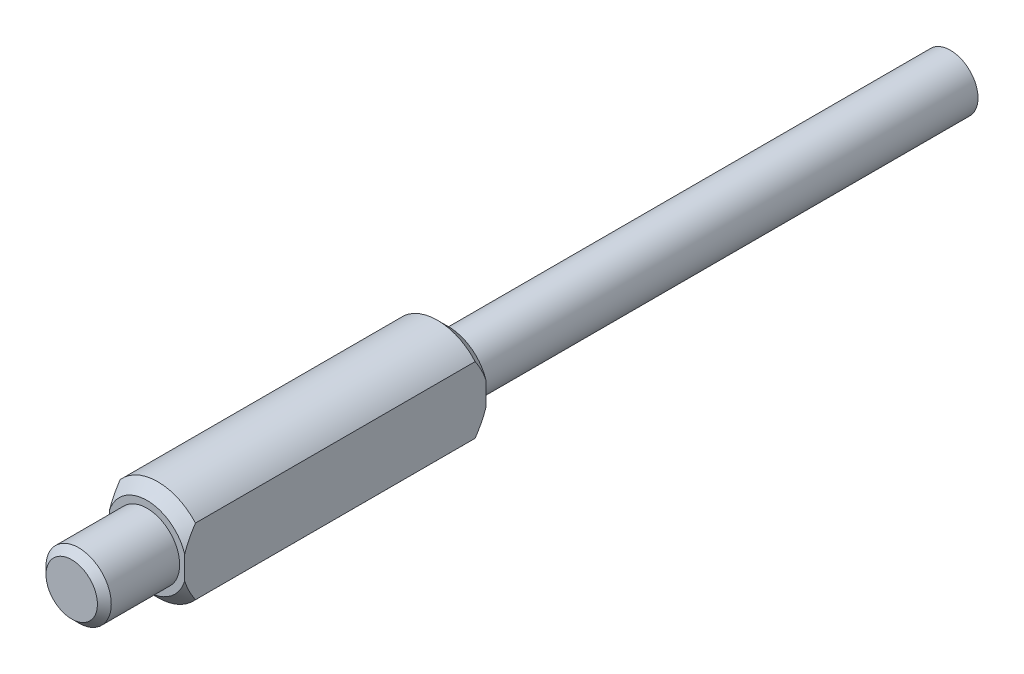
ISO-10303-21;
HEADER;
FILE_DESCRIPTION(('STEP AP214'),'2;1');
FILE_NAME('part.step','',(''),(''),'','','');
FILE_SCHEMA(('AUTOMOTIVE_DESIGN { 1 0 10303 214 1 1 1 1 }'));
ENDSEC;
DATA;
#1=APPLICATION_CONTEXT('core data for automotive mechanical design processes');
#2=APPLICATION_PROTOCOL_DEFINITION('international standard','automotive_design',2000,#1);
#3=PRODUCT_CONTEXT('',#1,'mechanical');
#4=PRODUCT('Part','Part','',(#3));
#5=PRODUCT_RELATED_PRODUCT_CATEGORY('part','',(#4));
#6=PRODUCT_DEFINITION_FORMATION('','',#4);
#7=PRODUCT_DEFINITION_CONTEXT('part definition',#1,'design');
#8=PRODUCT_DEFINITION('design','',#6,#7);
#9=PRODUCT_DEFINITION_SHAPE('','',#8);
#10=(LENGTH_UNIT() NAMED_UNIT(*) SI_UNIT(.MILLI.,.METRE.));
#11=(NAMED_UNIT(*) PLANE_ANGLE_UNIT() SI_UNIT($,.RADIAN.));
#12=(NAMED_UNIT(*) SI_UNIT($,.STERADIAN.) SOLID_ANGLE_UNIT());
#13=UNCERTAINTY_MEASURE_WITH_UNIT(LENGTH_MEASURE(1.E-05),#10,'distance_accuracy_value','');
#14=(GEOMETRIC_REPRESENTATION_CONTEXT(3) GLOBAL_UNCERTAINTY_ASSIGNED_CONTEXT((#13)) GLOBAL_UNIT_ASSIGNED_CONTEXT((#10,
#11,#12)) REPRESENTATION_CONTEXT('',''));
#15=CARTESIAN_POINT('',(0.,0.,0.));
#16=DIRECTION('',(0.,0.,1.));
#17=DIRECTION('',(1.,0.,0.));
#18=AXIS2_PLACEMENT_3D('',#15,#16,#17);
#19=CARTESIAN_POINT('',(0.,0.,0.));
#20=DIRECTION('',(0.,0.,-1.));
#21=DIRECTION('',(-1.,0.,0.));
#22=AXIS2_PLACEMENT_3D('',#19,#20,#21);
#23=PLANE('',#22);
#24=CARTESIAN_POINT('',(0.,0.,0.));
#25=DIRECTION('',(0.,0.,-1.));
#26=DIRECTION('',(-1.,0.,0.));
#27=AXIS2_PLACEMENT_3D('',#24,#25,#26);
#28=CIRCLE('',#27,1.02400000002945);
#29=CARTESIAN_POINT('',(-1.02400000002945,0.,0.));
#30=VERTEX_POINT('',#29);
#31=EDGE_CURVE('E18',#30,#30,#28,.T.);
#32=ORIENTED_EDGE('',*,*,#31,.F.);
#33=EDGE_LOOP('',(#32));
#34=FACE_BOUND('',#33,.T.);
#35=ADVANCED_FACE('F15',(#34),#23,.F.);
#36=CARTESIAN_POINT('',(0.,0.,-0.275999999928445));
#37=DIRECTION('',(0.,0.,-1.));
#38=DIRECTION('',(-1.,0.,0.));
#39=AXIS2_PLACEMENT_3D('',#36,#37,#38);
#40=CONICAL_SURFACE('',#39,1.30000000001473,0.785398163500426);
#41=ORIENTED_EDGE('',*,*,#31,.T.);
#42=EDGE_LOOP('',(#41));
#43=FACE_BOUND('',#42,.T.);
#44=CARTESIAN_POINT('',(0.,0.,-0.275999999999998));
#45=DIRECTION('',(0.,0.,1.));
#46=DIRECTION('',(1.,0.,0.));
#47=AXIS2_PLACEMENT_3D('',#44,#45,#46);
#48=CIRCLE('',#47,1.3);
#49=CARTESIAN_POINT('',(1.3,0.,-0.275999999999998));
#50=VERTEX_POINT('',#49);
#51=EDGE_CURVE('E87',#50,#50,#48,.F.);
#52=ORIENTED_EDGE('',*,*,#51,.F.);
#53=EDGE_LOOP('',(#52));
#54=FACE_BOUND('',#53,.T.);
#55=ADVANCED_FACE('F155',(#43,#54),#40,.T.);
#56=CARTESIAN_POINT('',(0.,0.,-35.));
#57=DIRECTION('',(0.,0.,1.));
#58=DIRECTION('',(1.,0.,0.));
#59=AXIS2_PLACEMENT_3D('',#56,#57,#58);
#60=CYLINDRICAL_SURFACE('',#59,1.3);
#61=ORIENTED_EDGE('',*,*,#51,.T.);
#62=EDGE_LOOP('',(#61));
#63=FACE_BOUND('',#62,.T.);
#64=CARTESIAN_POINT('',(0.,0.,-3.));
#65=DIRECTION('',(0.,0.,1.));
#66=DIRECTION('',(1.,0.,0.));
#67=AXIS2_PLACEMENT_3D('',#64,#65,#66);
#68=CIRCLE('',#67,1.3);
#69=CARTESIAN_POINT('',(1.3,0.,-3.));
#70=VERTEX_POINT('',#69);
#71=EDGE_CURVE('E86',#70,#70,#68,.T.);
#72=ORIENTED_EDGE('',*,*,#71,.T.);
#73=EDGE_LOOP('',(#72));
#74=FACE_BOUND('',#73,.T.);
#75=ADVANCED_FACE('F148',(#63,#74),#60,.T.);
#76=CARTESIAN_POINT('',(0.,1.3,-3.));
#77=DIRECTION('',(0.,0.,-1.));
#78=DIRECTION('',(-1.,0.,0.));
#79=AXIS2_PLACEMENT_3D('',#76,#77,#78);
#80=PLANE('',#79);
#81=ORIENTED_EDGE('',*,*,#71,.F.);
#82=EDGE_LOOP('',(#81));
#83=FACE_BOUND('',#82,.T.);
#84=DIRECTION('',(0.,1.,0.));
#85=VECTOR('',#84,1.);
#86=CARTESIAN_POINT('',(-1.5,1.3,-3.));
#87=LINE('',#86,#85);
#88=CARTESIAN_POINT('',(-1.5,-0.465263635205214,-2.99999999999295));
#89=VERTEX_POINT('',#88);
#90=CARTESIAN_POINT('',(-1.5,0.465263635205214,-2.99999999999295));
#91=VERTEX_POINT('',#90);
#92=EDGE_CURVE('E75',#89,#91,#87,.T.);
#93=ORIENTED_EDGE('',*,*,#92,.F.);
#94=CARTESIAN_POINT('',(0.,0.,-2.9999999999859));
#95=DIRECTION('',(0.,0.,-1.));
#96=DIRECTION('',(-1.,0.,0.));
#97=AXIS2_PLACEMENT_3D('',#94,#95,#96);
#98=CIRCLE('',#97,1.57050000007075);
#99=CARTESIAN_POINT('',(1.5,-0.465263635205212,-2.99999999999295));
#100=VERTEX_POINT('',#99);
#101=EDGE_CURVE('E107',#100,#89,#98,.T.);
#102=ORIENTED_EDGE('',*,*,#101,.F.);
#103=DIRECTION('',(0.,1.,0.));
#104=VECTOR('',#103,1.);
#105=CARTESIAN_POINT('',(1.5,-1.3228756555323,-3.));
#106=LINE('',#105,#104);
#107=CARTESIAN_POINT('',(1.5,0.465263635205212,-2.99999999999295));
#108=VERTEX_POINT('',#107);
#109=EDGE_CURVE('E93',#108,#100,#106,.F.);
#110=ORIENTED_EDGE('',*,*,#109,.F.);
#111=CARTESIAN_POINT('',(0.,0.,-2.9999999999859));
#112=DIRECTION('',(0.,0.,-1.));
#113=DIRECTION('',(-1.,0.,0.));
#114=AXIS2_PLACEMENT_3D('',#111,#112,#113);
#115=CIRCLE('',#114,1.57050000007075);
#116=EDGE_CURVE('E91',#91,#108,#115,.T.);
#117=ORIENTED_EDGE('',*,*,#116,.F.);
#118=EDGE_LOOP('',(#93,#102,#110,#117));
#119=FACE_BOUND('',#118,.T.);
#120=ADVANCED_FACE('F92',(#83,#119),#80,.F.);
#121=CARTESIAN_POINT('',(0.,0.,-3.42949999986786));
#122=DIRECTION('',(0.,0.,-1.));
#123=DIRECTION('',(-1.,0.,0.));
#124=AXIS2_PLACEMENT_3D('',#121,#122,#123);
#125=CONICAL_SURFACE('',#124,1.99999999995271,0.785398163397448);
#126=CARTESIAN_POINT('',(1.49999999998148,1.32287565556568,-3.42949999994954));
#127=CARTESIAN_POINT('',(1.49999999999318,1.28937727476954,-3.40734597331263));
#128=CARTESIAN_POINT('',(1.49999999999813,1.25566353973814,-3.38551626579726));
#129=CARTESIAN_POINT('',(1.50000000000187,1.18774349152264,-3.34262290432229));
#130=CARTESIAN_POINT('',(1.50000000000065,1.1535370823221,-3.32155940258622));
#131=CARTESIAN_POINT('',(1.49999999999871,1.05047791635497,-3.25992979938464));
#132=CARTESIAN_POINT('',(1.49999999999966,0.980824926778421,-3.22068297741509));
#133=CARTESIAN_POINT('',(1.50000000000034,0.838774657654793,-3.14701231190804));
#134=CARTESIAN_POINT('',(1.50000000000007,0.766372075919074,-3.11259845782633));
#135=CARTESIAN_POINT('',(1.49999999999997,0.655395826776433,-3.0660856130718));
#136=CARTESIAN_POINT('',(1.49999999999998,0.617907480591551,-3.05140109715024));
#137=CARTESIAN_POINT('',(1.50000000000002,0.542159001899353,-3.02408055847353));
#138=CARTESIAN_POINT('',(1.50000000000003,0.5038982498943,-3.01144625993906));
#139=CARTESIAN_POINT('',(1.5,0.46526363496972,-2.99999999992319));
#140=B_SPLINE_CURVE_WITH_KNOTS('',3,(#126,#127,#128,#129,#130,#131,#132,#133,#134,#135,#136,
#137,#138,#139),.UNSPECIFIED.,.F.,.F.,(4,2,2,2,2,2,4),(0.,0.120482301635042,0.240988410416806,
0.48070059811357,0.720901185332129,0.841632697718104,0.962465224197528),.UNSPECIFIED.);
#141=CARTESIAN_POINT('',(1.5,1.32287565555182,-3.42949999997049));
#142=VERTEX_POINT('',#141);
#143=EDGE_CURVE('E96',#142,#108,#140,.T.);
#144=ORIENTED_EDGE('',*,*,#143,.F.);
#145=CARTESIAN_POINT('',(0.,0.,-3.4295));
#146=DIRECTION('',(0.,0.,1.));
#147=DIRECTION('',(1.,0.,0.));
#148=AXIS2_PLACEMENT_3D('',#145,#146,#147);
#149=CIRCLE('',#148,2.);
#150=CARTESIAN_POINT('',(-1.5,1.32287565555182,-3.42949999997049));
#151=VERTEX_POINT('',#150);
#152=EDGE_CURVE('E100',#151,#142,#149,.F.);
#153=ORIENTED_EDGE('',*,*,#152,.F.);
#154=CARTESIAN_POINT('',(-1.49999999999281,0.465263634967894,-2.99999999992595));
#155=CARTESIAN_POINT('',(-1.49999999999735,0.503898249893061,-3.01144625993991));
#156=CARTESIAN_POINT('',(-1.49999999999928,0.542159001898358,-3.02408055847354));
#157=CARTESIAN_POINT('',(-1.50000000000072,0.617907480590708,-3.05140109714957));
#158=CARTESIAN_POINT('',(-1.50000000000025,0.6553958267755,-3.06608561307129));
#159=CARTESIAN_POINT('',(-1.4999999999995,0.766372075917955,-3.1125984578261));
#160=CARTESIAN_POINT('',(-1.49999999999987,0.838774657653623,-3.14701231190774));
#161=CARTESIAN_POINT('',(-1.50000000000013,0.980824926777255,-3.22068297741417));
#162=CARTESIAN_POINT('',(-1.50000000000003,1.05047791635386,-3.25992979938318));
#163=CARTESIAN_POINT('',(-1.49999999999999,1.15353708232007,-3.32155940258541));
#164=CARTESIAN_POINT('',(-1.49999999999999,1.18774349152012,-3.34262290432195));
#165=CARTESIAN_POINT('',(-1.50000000000001,1.25566353973647,-3.38551626579496));
#166=CARTESIAN_POINT('',(-1.50000000000001,1.28937727476922,-3.4073459733079));
#167=CARTESIAN_POINT('',(-1.5,1.32287565556873,-3.42949999993925));
#168=B_SPLINE_CURVE_WITH_KNOTS('',3,(#154,#155,#156,#157,#158,#159,#160,#161,#162,#163,#164,
#165,#166,#167),.UNSPECIFIED.,.F.,.F.,(4,2,2,2,2,2,4),(0.,0.120832526479323,0.241564038865178,
0.481764626083627,0.721476813779608,0.841982922560897,0.962465224195373),.UNSPECIFIED.);
#169=EDGE_CURVE('E80',#91,#151,#168,.T.);
#170=ORIENTED_EDGE('',*,*,#169,.F.);
#171=ORIENTED_EDGE('',*,*,#116,.T.);
#172=EDGE_LOOP('',(#144,#153,#170,#171));
#173=FACE_BOUND('',#172,.T.);
#174=ADVANCED_FACE('F98',(#173),#125,.T.);
#175=CARTESIAN_POINT('',(1.5,-1.3228756555323,-15.));
#176=DIRECTION('',(1.,0.,0.));
#177=DIRECTION('',(0.,0.,-1.));
#178=AXIS2_PLACEMENT_3D('',#175,#176,#177);
#179=PLANE('',#178);
#180=CARTESIAN_POINT('',(1.5,0.465263634944172,-14.9999999999998));
#181=CARTESIAN_POINT('',(1.5,0.503898249868147,-14.9885537399831));
#182=CARTESIAN_POINT('',(1.5,0.542159001872541,-14.9759194414478));
#183=CARTESIAN_POINT('',(1.5,0.617907480563299,-14.9485989027691));
#184=CARTESIAN_POINT('',(1.5,0.655395826747401,-14.9339143868465));
#185=CARTESIAN_POINT('',(1.5,0.766372075887486,-14.8874015420885));
#186=CARTESIAN_POINT('',(1.5,0.83877465762119,-14.8529876880041));
#187=CARTESIAN_POINT('',(1.5,0.980824926740572,-14.779317022492));
#188=CARTESIAN_POINT('',(1.5,1.05047791631489,-14.7400702005202));
#189=CARTESIAN_POINT('',(1.5,1.15353708227743,-14.6784405973134));
#190=CARTESIAN_POINT('',(1.5,1.18774349147622,-14.6573770955754));
#191=CARTESIAN_POINT('',(1.5,1.25566353968998,-14.6144837340993));
#192=CARTESIAN_POINT('',(1.5,1.28937727472138,-14.5926540265848));
#193=CARTESIAN_POINT('',(1.5,1.32287565551952,-14.5704999999519));
#194=B_SPLINE_CURVE_WITH_KNOTS('',3,(#180,#181,#182,#183,#184,#185,#186,#187,#188,#189,#190,
#191,#192,#193),.UNSPECIFIED.,.F.,.F.,(4,2,2,2,2,2,4),(0.,0.120832526478356,0.241564038863305,
0.481764626079882,0.721476813774111,0.841982922554592,0.962465224188233),.UNSPECIFIED.);
#195=CARTESIAN_POINT('',(1.5,0.465263634966859,-14.9999999999931));
#196=VERTEX_POINT('',#195);
#197=CARTESIAN_POINT('',(1.5,1.32287565552554,-14.5704999999431));
#198=VERTEX_POINT('',#197);
#199=EDGE_CURVE('E212',#196,#198,#194,.T.);
#200=ORIENTED_EDGE('',*,*,#199,.T.);
#201=DIRECTION('',(0.,0.,1.));
#202=VECTOR('',#201,1.);
#203=CARTESIAN_POINT('',(1.5,1.3228756555323,-35.));
#204=LINE('',#203,#202);
#205=EDGE_CURVE('E203',#142,#198,#204,.F.);
#206=ORIENTED_EDGE('',*,*,#205,.F.);
#207=ORIENTED_EDGE('',*,*,#143,.T.);
#208=ORIENTED_EDGE('',*,*,#109,.T.);
#209=CARTESIAN_POINT('',(1.5,-1.32287565556378,-3.42949999993597));
#210=CARTESIAN_POINT('',(1.5,-1.28937727476458,-3.40734597330488));
#211=CARTESIAN_POINT('',(1.5,-1.25566353973214,-3.38551626579218));
#212=CARTESIAN_POINT('',(1.5,-1.18774349151641,-3.34262290431964));
#213=CARTESIAN_POINT('',(1.5,-1.15353708231668,-3.32155940258334));
#214=CARTESIAN_POINT('',(1.5,-1.05047791635138,-3.25992979938178));
#215=CARTESIAN_POINT('',(1.5,-0.980824926775367,-3.22068297741322));
#216=CARTESIAN_POINT('',(1.5,-0.838774657653107,-3.14701231190745));
#217=CARTESIAN_POINT('',(1.5,-0.766372075918215,-3.11259845782601));
#218=CARTESIAN_POINT('',(1.5,-0.655395826776818,-3.06608561307194));
#219=CARTESIAN_POINT('',(1.5,-0.617907480592377,-3.05140109715055));
#220=CARTESIAN_POINT('',(1.5,-0.542159001901102,-3.02408055847415));
#221=CARTESIAN_POINT('',(1.5,-0.50389824989653,-3.0114462599398));
#222=CARTESIAN_POINT('',(1.5,-0.465263634972458,-2.999999999924));
#223=B_SPLINE_CURVE_WITH_KNOTS('',3,(#209,#210,#211,#212,#213,#214,#215,#216,#217,#218,#219,
#220,#221,#222),.UNSPECIFIED.,.F.,.F.,(4,2,2,2,2,2,4),(0.,0.120482301633292,0.240988410413418,
0.480700598107202,0.720901185323238,0.841632697707789,0.962465224185715),.UNSPECIFIED.);
#224=CARTESIAN_POINT('',(1.5,-1.32287565554804,-3.42949999996799));
#225=VERTEX_POINT('',#224);
#226=EDGE_CURVE('E228',#225,#100,#223,.T.);
#227=ORIENTED_EDGE('',*,*,#226,.F.);
#228=DIRECTION('',(0.,0.,1.));
#229=VECTOR('',#228,1.);
#230=CARTESIAN_POINT('',(1.5,-1.3228756555323,-35.));
#231=LINE('',#230,#229);
#232=CARTESIAN_POINT('',(1.5,-1.32287565552554,-14.5704999999431));
#233=VERTEX_POINT('',#232);
#234=EDGE_CURVE('E206',#233,#225,#231,.T.);
#235=ORIENTED_EDGE('',*,*,#234,.F.);
#236=CARTESIAN_POINT('',(1.50000000000532,-1.3228756555204,-14.5704999999548));
#237=CARTESIAN_POINT('',(1.50000000000196,-1.2893772747213,-14.5926540265861));
#238=CARTESIAN_POINT('',(1.50000000000054,-1.25566353968951,-14.6144837340999));
#239=CARTESIAN_POINT('',(1.49999999999946,-1.18774349147552,-14.6573770955755));
#240=CARTESIAN_POINT('',(1.49999999999981,-1.15353708227687,-14.6784405973137));
#241=CARTESIAN_POINT('',(1.50000000000037,-1.05047791631461,-14.7400702005205));
#242=CARTESIAN_POINT('',(1.5000000000001,-0.980824926740272,-14.7793170224922));
#243=CARTESIAN_POINT('',(1.4999999999999,-0.838774657620922,-14.8529876880042));
#244=CARTESIAN_POINT('',(1.49999999999998,-0.766372075887268,-14.8874015420886));
#245=CARTESIAN_POINT('',(1.50000000000001,-0.655395826747246,-14.9339143868466));
#246=CARTESIAN_POINT('',(1.50000000000001,-0.61790748056317,-14.9485989027692));
#247=CARTESIAN_POINT('',(1.5,-0.54215900187247,-14.9759194414478));
#248=CARTESIAN_POINT('',(1.49999999999999,-0.503898249868109,-14.9885537399831));
#249=CARTESIAN_POINT('',(1.5,-0.465263634944173,-14.9999999999998));
#250=B_SPLINE_CURVE_WITH_KNOTS('',3,(#236,#237,#238,#239,#240,#241,#242,#243,#244,#245,#246,
#247,#248,#249),.UNSPECIFIED.,.F.,.F.,(4,2,2,2,2,2,4),(0.,0.120482301633456,0.240988410413782,
0.480700598107778,0.720901185324259,0.841632697709118,0.962465224187363),.UNSPECIFIED.);
#251=CARTESIAN_POINT('',(1.5,-0.465263634966521,-14.9999999999932));
#252=VERTEX_POINT('',#251);
#253=EDGE_CURVE('E139',#233,#252,#250,.T.);
#254=ORIENTED_EDGE('',*,*,#253,.T.);
#255=DIRECTION('',(0.,1.,0.));
#256=VECTOR('',#255,1.);
#257=CARTESIAN_POINT('',(1.5,-1.3228756555323,-15.));
#258=LINE('',#257,#256);
#259=EDGE_CURVE('E209',#252,#196,#258,.T.);
#260=ORIENTED_EDGE('',*,*,#259,.T.);
#261=EDGE_LOOP('',(#200,#206,#207,#208,#227,#235,#254,#260));
#262=FACE_BOUND('',#261,.T.);
#263=ADVANCED_FACE('F130',(#262),#179,.T.);
#264=CARTESIAN_POINT('',(0.,0.,-3.42949999986786));
#265=DIRECTION('',(0.,0.,-1.));
#266=DIRECTION('',(-1.,0.,0.));
#267=AXIS2_PLACEMENT_3D('',#264,#265,#266);
#268=CONICAL_SURFACE('',#267,1.99999999995271,0.785398163397448);
#269=CARTESIAN_POINT('',(-1.49999999998148,-1.32287565556568,-3.42949999994954));
#270=CARTESIAN_POINT('',(-1.49999999999318,-1.28937727476954,-3.40734597331263));
#271=CARTESIAN_POINT('',(-1.49999999999813,-1.25566353973814,-3.38551626579726));
#272=CARTESIAN_POINT('',(-1.50000000000187,-1.18774349152264,-3.34262290432229));
#273=CARTESIAN_POINT('',(-1.50000000000065,-1.1535370823221,-3.32155940258622));
#274=CARTESIAN_POINT('',(-1.49999999999871,-1.05047791635497,-3.25992979938464));
#275=CARTESIAN_POINT('',(-1.49999999999966,-0.980824926778421,-3.22068297741509));
#276=CARTESIAN_POINT('',(-1.50000000000034,-0.838774657654793,-3.14701231190804));
#277=CARTESIAN_POINT('',(-1.50000000000007,-0.766372075919074,-3.11259845782633));
#278=CARTESIAN_POINT('',(-1.49999999999997,-0.655395826776433,-3.0660856130718));
#279=CARTESIAN_POINT('',(-1.49999999999998,-0.617907480591551,-3.05140109715024));
#280=CARTESIAN_POINT('',(-1.50000000000002,-0.542159001899353,-3.02408055847353));
#281=CARTESIAN_POINT('',(-1.50000000000003,-0.5038982498943,-3.01144625993906));
#282=CARTESIAN_POINT('',(-1.5,-0.46526363496972,-2.99999999992319));
#283=B_SPLINE_CURVE_WITH_KNOTS('',3,(#269,#270,#271,#272,#273,#274,#275,#276,#277,#278,#279,
#280,#281,#282),.UNSPECIFIED.,.F.,.F.,(4,2,2,2,2,2,4),(0.,0.120482301635042,0.240988410416806,
0.48070059811357,0.720901185332129,0.841632697718104,0.962465224197528),.UNSPECIFIED.);
#284=CARTESIAN_POINT('',(-1.5,-1.32287565555182,-3.42949999997049));
#285=VERTEX_POINT('',#284);
#286=EDGE_CURVE('E82',#285,#89,#283,.T.);
#287=ORIENTED_EDGE('',*,*,#286,.F.);
#288=CARTESIAN_POINT('',(0.,0.,-3.4295));
#289=DIRECTION('',(0.,0.,1.));
#290=DIRECTION('',(1.,0.,0.));
#291=AXIS2_PLACEMENT_3D('',#288,#289,#290);
#292=CIRCLE('',#291,2.);
#293=EDGE_CURVE('E215',#225,#285,#292,.F.);
#294=ORIENTED_EDGE('',*,*,#293,.F.);
#295=ORIENTED_EDGE('',*,*,#226,.T.);
#296=ORIENTED_EDGE('',*,*,#101,.T.);
#297=EDGE_LOOP('',(#287,#294,#295,#296));
#298=FACE_BOUND('',#297,.T.);
#299=ADVANCED_FACE('F237',(#298),#268,.T.);
#300=CARTESIAN_POINT('',(-1.5,1.3228756555323,-15.));
#301=DIRECTION('',(-1.,0.,0.));
#302=DIRECTION('',(0.,0.,1.));
#303=AXIS2_PLACEMENT_3D('',#300,#301,#302);
#304=PLANE('',#303);
#305=CARTESIAN_POINT('',(-1.5,-0.465263634944172,-14.9999999999998));
#306=CARTESIAN_POINT('',(-1.5,-0.503898249868146,-14.9885537399831));
#307=CARTESIAN_POINT('',(-1.5,-0.542159001872541,-14.9759194414478));
#308=CARTESIAN_POINT('',(-1.5,-0.617907480563299,-14.9485989027691));
#309=CARTESIAN_POINT('',(-1.5,-0.655395826747401,-14.9339143868465));
#310=CARTESIAN_POINT('',(-1.5,-0.766372075887485,-14.8874015420885));
#311=CARTESIAN_POINT('',(-1.5,-0.83877465762119,-14.8529876880041));
#312=CARTESIAN_POINT('',(-1.5,-0.980824926740571,-14.779317022492));
#313=CARTESIAN_POINT('',(-1.5,-1.05047791631489,-14.7400702005202));
#314=CARTESIAN_POINT('',(-1.5,-1.15353708227743,-14.6784405973134));
#315=CARTESIAN_POINT('',(-1.5,-1.18774349147622,-14.6573770955754));
#316=CARTESIAN_POINT('',(-1.5,-1.25566353968998,-14.6144837340993));
#317=CARTESIAN_POINT('',(-1.5,-1.28937727472138,-14.5926540265848));
#318=CARTESIAN_POINT('',(-1.5,-1.32287565551952,-14.5704999999519));
#319=B_SPLINE_CURVE_WITH_KNOTS('',3,(#305,#306,#307,#308,#309,#310,#311,#312,#313,#314,#315,
#316,#317,#318),.UNSPECIFIED.,.F.,.F.,(4,2,2,2,2,2,4),(0.,0.120832526478356,0.241564038863305,
0.481764626079882,0.721476813774111,0.841982922554592,0.962465224188234),.UNSPECIFIED.);
#320=CARTESIAN_POINT('',(-1.5,-0.465263634966859,-14.9999999999931));
#321=VERTEX_POINT('',#320);
#322=CARTESIAN_POINT('',(-1.5,-1.32287565552554,-14.5704999999431));
#323=VERTEX_POINT('',#322);
#324=EDGE_CURVE('E33',#321,#323,#319,.T.);
#325=ORIENTED_EDGE('',*,*,#324,.T.);
#326=DIRECTION('',(0.,0.,1.));
#327=VECTOR('',#326,1.);
#328=CARTESIAN_POINT('',(-1.5,-1.3228756555323,-35.));
#329=LINE('',#328,#327);
#330=EDGE_CURVE('E202',#285,#323,#329,.F.);
#331=ORIENTED_EDGE('',*,*,#330,.F.);
#332=ORIENTED_EDGE('',*,*,#286,.T.);
#333=ORIENTED_EDGE('',*,*,#92,.T.);
#334=ORIENTED_EDGE('',*,*,#169,.T.);
#335=DIRECTION('',(0.,0.,1.));
#336=VECTOR('',#335,1.);
#337=CARTESIAN_POINT('',(-1.5,1.3228756555323,-35.));
#338=LINE('',#337,#336);
#339=CARTESIAN_POINT('',(-1.5,1.32287565552554,-14.5704999999431));
#340=VERTEX_POINT('',#339);
#341=EDGE_CURVE('E184',#340,#151,#338,.T.);
#342=ORIENTED_EDGE('',*,*,#341,.F.);
#343=CARTESIAN_POINT('',(-1.50000000000532,1.3228756555204,-14.5704999999548));
#344=CARTESIAN_POINT('',(-1.50000000000196,1.2893772747213,-14.5926540265861));
#345=CARTESIAN_POINT('',(-1.50000000000054,1.25566353968951,-14.6144837340999));
#346=CARTESIAN_POINT('',(-1.49999999999946,1.18774349147552,-14.6573770955755));
#347=CARTESIAN_POINT('',(-1.49999999999981,1.15353708227687,-14.6784405973137));
#348=CARTESIAN_POINT('',(-1.50000000000037,1.05047791631461,-14.7400702005206));
#349=CARTESIAN_POINT('',(-1.5000000000001,0.980824926740271,-14.7793170224922));
#350=CARTESIAN_POINT('',(-1.4999999999999,0.838774657620922,-14.8529876880042));
#351=CARTESIAN_POINT('',(-1.49999999999998,0.766372075887268,-14.8874015420886));
#352=CARTESIAN_POINT('',(-1.50000000000001,0.655395826747246,-14.9339143868466));
#353=CARTESIAN_POINT('',(-1.50000000000001,0.617907480563169,-14.9485989027692));
#354=CARTESIAN_POINT('',(-1.5,0.542159001872469,-14.9759194414478));
#355=CARTESIAN_POINT('',(-1.49999999999999,0.503898249868109,-14.9885537399831));
#356=CARTESIAN_POINT('',(-1.5,0.465263634944172,-14.9999999999998));
#357=B_SPLINE_CURVE_WITH_KNOTS('',3,(#343,#344,#345,#346,#347,#348,#349,#350,#351,#352,#353,
#354,#355,#356),.UNSPECIFIED.,.F.,.F.,(4,2,2,2,2,2,4),(0.,0.120482301633457,0.240988410413784,
0.480700598107779,0.720901185324259,0.841632697709119,0.962465224187364),.UNSPECIFIED.);
#358=CARTESIAN_POINT('',(-1.5,0.465263634966521,-14.9999999999932));
#359=VERTEX_POINT('',#358);
#360=EDGE_CURVE('E102',#340,#359,#357,.T.);
#361=ORIENTED_EDGE('',*,*,#360,.T.);
#362=DIRECTION('',(0.,1.,0.));
#363=VECTOR('',#362,1.);
#364=CARTESIAN_POINT('',(-1.5,1.3228756555323,-15.));
#365=LINE('',#364,#363);
#366=EDGE_CURVE('E105',#359,#321,#365,.F.);
#367=ORIENTED_EDGE('',*,*,#366,.T.);
#368=EDGE_LOOP('',(#325,#331,#332,#333,#334,#342,#361,#367));
#369=FACE_BOUND('',#368,.T.);
#370=ADVANCED_FACE('F77',(#369),#304,.T.);
#371=CARTESIAN_POINT('',(0.,0.,-35.));
#372=DIRECTION('',(0.,0.,1.));
#373=DIRECTION('',(1.,0.,0.));
#374=AXIS2_PLACEMENT_3D('',#371,#372,#373);
#375=CYLINDRICAL_SURFACE('',#374,2.);
#376=ORIENTED_EDGE('',*,*,#205,.T.);
#377=CARTESIAN_POINT('',(0.,0.,-14.5704999999339));
#378=DIRECTION('',(0.,0.,1.));
#379=DIRECTION('',(1.,0.,0.));
#380=AXIS2_PLACEMENT_3D('',#377,#378,#379);
#381=CIRCLE('',#380,2.00000000000955);
#382=EDGE_CURVE('E199',#340,#198,#381,.F.);
#383=ORIENTED_EDGE('',*,*,#382,.F.);
#384=ORIENTED_EDGE('',*,*,#341,.T.);
#385=ORIENTED_EDGE('',*,*,#152,.T.);
#386=EDGE_LOOP('',(#376,#383,#384,#385));
#387=FACE_BOUND('',#386,.T.);
#388=ADVANCED_FACE('F246',(#387),#375,.T.);
#389=CARTESIAN_POINT('',(0.,0.,-35.));
#390=DIRECTION('',(0.,0.,1.));
#391=DIRECTION('',(1.,0.,0.));
#392=AXIS2_PLACEMENT_3D('',#389,#390,#391);
#393=CYLINDRICAL_SURFACE('',#392,2.);
#394=ORIENTED_EDGE('',*,*,#330,.T.);
#395=CARTESIAN_POINT('',(0.,0.,-14.5704999999339));
#396=DIRECTION('',(0.,0.,1.));
#397=DIRECTION('',(1.,0.,0.));
#398=AXIS2_PLACEMENT_3D('',#395,#396,#397);
#399=CIRCLE('',#398,2.00000000000955);
#400=EDGE_CURVE('E189',#233,#323,#399,.F.);
#401=ORIENTED_EDGE('',*,*,#400,.F.);
#402=ORIENTED_EDGE('',*,*,#234,.T.);
#403=ORIENTED_EDGE('',*,*,#293,.T.);
#404=EDGE_LOOP('',(#394,#401,#402,#403));
#405=FACE_BOUND('',#404,.T.);
#406=ADVANCED_FACE('F250',(#405),#393,.T.);
#407=CARTESIAN_POINT('',(0.,0.,-14.5704999999339));
#408=DIRECTION('',(0.,0.,1.));
#409=DIRECTION('',(1.,0.,0.));
#410=AXIS2_PLACEMENT_3D('',#407,#408,#409);
#411=CONICAL_SURFACE('',#410,2.00000000000955,0.785398163331274);
#412=ORIENTED_EDGE('',*,*,#199,.F.);
#413=CARTESIAN_POINT('',(0.,0.,-14.9999999999864));
#414=DIRECTION('',(0.,0.,1.));
#415=DIRECTION('',(1.,0.,0.));
#416=AXIS2_PLACEMENT_3D('',#413,#414,#415);
#417=CIRCLE('',#416,1.57050000001391);
#418=EDGE_CURVE('E185',#196,#359,#417,.T.);
#419=ORIENTED_EDGE('',*,*,#418,.T.);
#420=ORIENTED_EDGE('',*,*,#360,.F.);
#421=ORIENTED_EDGE('',*,*,#382,.T.);
#422=EDGE_LOOP('',(#412,#419,#420,#421));
#423=FACE_BOUND('',#422,.T.);
#424=ADVANCED_FACE('F175',(#423),#411,.T.);
#425=CARTESIAN_POINT('',(0.,0.,-14.5704999999339));
#426=DIRECTION('',(0.,0.,1.));
#427=DIRECTION('',(1.,0.,0.));
#428=AXIS2_PLACEMENT_3D('',#425,#426,#427);
#429=CONICAL_SURFACE('',#428,2.00000000000955,0.785398163331274);
#430=ORIENTED_EDGE('',*,*,#324,.F.);
#431=CARTESIAN_POINT('',(0.,0.,-14.9999999999864));
#432=DIRECTION('',(0.,0.,1.));
#433=DIRECTION('',(1.,0.,0.));
#434=AXIS2_PLACEMENT_3D('',#431,#432,#433);
#435=CIRCLE('',#434,1.57050000001391);
#436=EDGE_CURVE('E188',#321,#252,#435,.T.);
#437=ORIENTED_EDGE('',*,*,#436,.T.);
#438=ORIENTED_EDGE('',*,*,#253,.F.);
#439=ORIENTED_EDGE('',*,*,#400,.T.);
#440=EDGE_LOOP('',(#430,#437,#438,#439));
#441=FACE_BOUND('',#440,.T.);
#442=ADVANCED_FACE('F171',(#441),#429,.T.);
#443=CARTESIAN_POINT('',(0.,1.1,-35.));
#444=DIRECTION('',(0.,0.,1.));
#445=DIRECTION('',(1.,0.,0.));
#446=AXIS2_PLACEMENT_3D('',#443,#444,#445);
#447=PLANE('',#446);
#448=CARTESIAN_POINT('',(0.,0.,-35.));
#449=DIRECTION('',(0.,0.,1.));
#450=DIRECTION('',(1.,0.,0.));
#451=AXIS2_PLACEMENT_3D('',#448,#449,#450);
#452=CIRCLE('',#451,1.1);
#453=CARTESIAN_POINT('',(1.1,0.,-35.));
#454=VERTEX_POINT('',#453);
#455=EDGE_CURVE('E24',#454,#454,#452,.T.);
#456=ORIENTED_EDGE('',*,*,#455,.F.);
#457=EDGE_LOOP('',(#456));
#458=FACE_BOUND('',#457,.T.);
#459=ADVANCED_FACE('F165',(#458),#447,.F.);
#460=CARTESIAN_POINT('',(0.,1.5705,-15.));
#461=DIRECTION('',(0.,0.,1.));
#462=DIRECTION('',(1.,0.,0.));
#463=AXIS2_PLACEMENT_3D('',#460,#461,#462);
#464=PLANE('',#463);
#465=ORIENTED_EDGE('',*,*,#436,.F.);
#466=ORIENTED_EDGE('',*,*,#366,.F.);
#467=ORIENTED_EDGE('',*,*,#418,.F.);
#468=ORIENTED_EDGE('',*,*,#259,.F.);
#469=EDGE_LOOP('',(#465,#466,#467,#468));
#470=FACE_BOUND('',#469,.T.);
#471=CARTESIAN_POINT('',(0.,0.,-15.));
#472=DIRECTION('',(0.,0.,1.));
#473=DIRECTION('',(1.,0.,0.));
#474=AXIS2_PLACEMENT_3D('',#471,#472,#473);
#475=CIRCLE('',#474,1.1);
#476=CARTESIAN_POINT('',(1.1,0.,-15.));
#477=VERTEX_POINT('',#476);
#478=EDGE_CURVE('E10',#477,#477,#475,.F.);
#479=ORIENTED_EDGE('',*,*,#478,.F.);
#480=EDGE_LOOP('',(#479));
#481=FACE_BOUND('',#480,.T.);
#482=ADVANCED_FACE('F159',(#470,#481),#464,.F.);
#483=CARTESIAN_POINT('',(0.,0.,-35.));
#484=DIRECTION('',(0.,0.,1.));
#485=DIRECTION('',(1.,0.,0.));
#486=AXIS2_PLACEMENT_3D('',#483,#484,#485);
#487=CYLINDRICAL_SURFACE('',#486,1.1);
#488=ORIENTED_EDGE('',*,*,#478,.T.);
#489=EDGE_LOOP('',(#488));
#490=FACE_BOUND('',#489,.T.);
#491=ORIENTED_EDGE('',*,*,#455,.T.);
#492=EDGE_LOOP('',(#491));
#493=FACE_BOUND('',#492,.T.);
#494=ADVANCED_FACE('F157',(#490,#493),#487,.T.);
#495=CLOSED_SHELL('',(#35,#55,#75,#120,#174,#263,#299,#370,#388,#406,#424,#442,#459,#482,#494));
#496=MANIFOLD_SOLID_BREP('B1',#495);
#497=ADVANCED_BREP_SHAPE_REPRESENTATION('',(#18,#496),#14);
#498=SHAPE_DEFINITION_REPRESENTATION(#9,#497);
ENDSEC;
END-ISO-10303-21;
